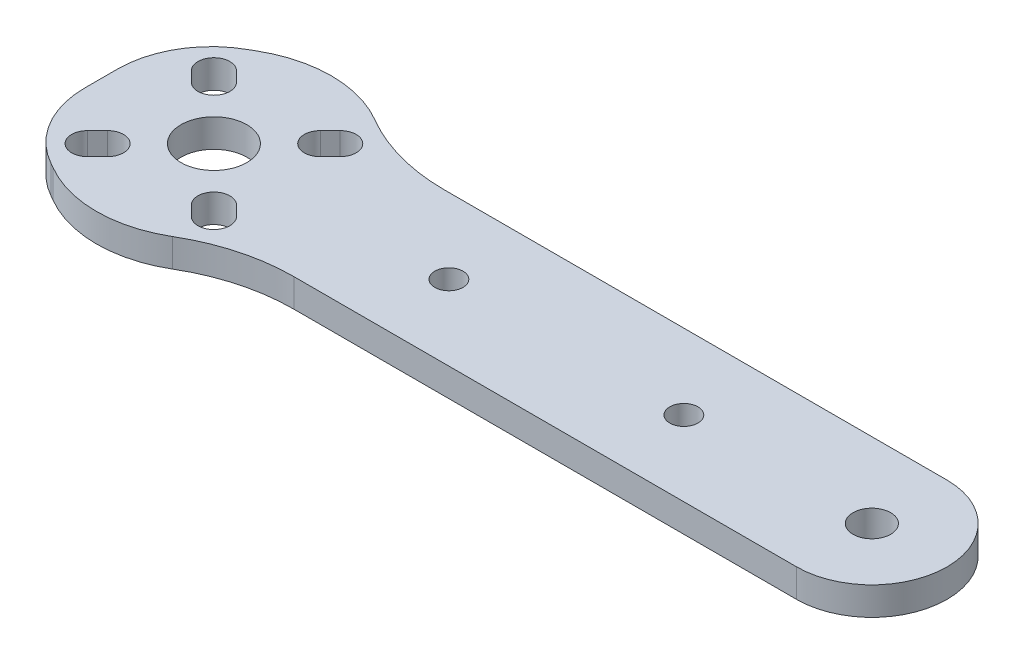
ISO-10303-21;
HEADER;
FILE_DESCRIPTION(('STEP AP214'),'2;1');
FILE_NAME('part.step','',(''),(''),'','','');
FILE_SCHEMA(('AUTOMOTIVE_DESIGN { 1 0 10303 214 1 1 1 1 }'));
ENDSEC;
DATA;
#1=APPLICATION_CONTEXT('core data for automotive mechanical design processes');
#2=APPLICATION_PROTOCOL_DEFINITION('international standard','automotive_design',2000,#1);
#3=PRODUCT_CONTEXT('',#1,'mechanical');
#4=PRODUCT('Part','Part','',(#3));
#5=PRODUCT_RELATED_PRODUCT_CATEGORY('part','',(#4));
#6=PRODUCT_DEFINITION_FORMATION('','',#4);
#7=PRODUCT_DEFINITION_CONTEXT('part definition',#1,'design');
#8=PRODUCT_DEFINITION('design','',#6,#7);
#9=PRODUCT_DEFINITION_SHAPE('','',#8);
#10=(LENGTH_UNIT() NAMED_UNIT(*) SI_UNIT(.MILLI.,.METRE.));
#11=(NAMED_UNIT(*) PLANE_ANGLE_UNIT() SI_UNIT($,.RADIAN.));
#12=(NAMED_UNIT(*) SI_UNIT($,.STERADIAN.) SOLID_ANGLE_UNIT());
#13=UNCERTAINTY_MEASURE_WITH_UNIT(LENGTH_MEASURE(1.E-05),#10,'distance_accuracy_value','');
#14=(GEOMETRIC_REPRESENTATION_CONTEXT(3) GLOBAL_UNCERTAINTY_ASSIGNED_CONTEXT((#13)) GLOBAL_UNIT_ASSIGNED_CONTEXT((#10,
#11,#12)) REPRESENTATION_CONTEXT('',''));
#15=CARTESIAN_POINT('',(0.,0.,0.));
#16=DIRECTION('',(0.,0.,1.));
#17=DIRECTION('',(1.,0.,0.));
#18=AXIS2_PLACEMENT_3D('',#15,#16,#17);
#19=CARTESIAN_POINT('',(0.,3.,-8.));
#20=DIRECTION('',(0.,0.,1.));
#21=DIRECTION('',(1.,0.,0.));
#22=AXIS2_PLACEMENT_3D('',#19,#20,#21);
#23=PLANE('',#22);
#24=DIRECTION('',(-1.,0.,0.));
#25=VECTOR('',#24,1.);
#26=CARTESIAN_POINT('',(0.,0.,-8.));
#27=LINE('',#26,#25);
#28=CARTESIAN_POINT('',(150.,0.,-8.));
#29=VERTEX_POINT('',#28);
#30=CARTESIAN_POINT('',(96.5,0.,-8.));
#31=VERTEX_POINT('',#30);
#32=EDGE_CURVE('E384',#29,#31,#27,.T.);
#33=ORIENTED_EDGE('',*,*,#32,.T.);
#34=DIRECTION('',(0.,1.,0.));
#35=VECTOR('',#34,1.);
#36=CARTESIAN_POINT('',(96.5,3.,-8.));
#37=LINE('',#36,#35);
#38=CARTESIAN_POINT('',(96.5,3.,-8.));
#39=VERTEX_POINT('',#38);
#40=EDGE_CURVE('E407',#31,#39,#37,.T.);
#41=ORIENTED_EDGE('',*,*,#40,.T.);
#42=DIRECTION('',(-1.,0.,0.));
#43=VECTOR('',#42,1.);
#44=CARTESIAN_POINT('',(0.,3.,-8.));
#45=LINE('',#44,#43);
#46=CARTESIAN_POINT('',(150.,3.,-8.));
#47=VERTEX_POINT('',#46);
#48=EDGE_CURVE('E386',#47,#39,#45,.T.);
#49=ORIENTED_EDGE('',*,*,#48,.F.);
#50=DIRECTION('',(0.,-1.,0.));
#51=VECTOR('',#50,1.);
#52=CARTESIAN_POINT('',(150.,3.,-8.));
#53=LINE('',#52,#51);
#54=EDGE_CURVE('E389',#47,#29,#53,.T.);
#55=ORIENTED_EDGE('',*,*,#54,.T.);
#56=EDGE_LOOP('',(#33,#41,#49,#55));
#57=FACE_BOUND('',#56,.T.);
#58=ADVANCED_FACE('F38',(#57),#23,.F.);
#59=CARTESIAN_POINT('',(0.,3.,8.));
#60=DIRECTION('',(0.,0.,-1.));
#61=DIRECTION('',(-1.,0.,0.));
#62=AXIS2_PLACEMENT_3D('',#59,#60,#61);
#63=PLANE('',#62);
#64=DIRECTION('',(1.,0.,0.));
#65=VECTOR('',#64,1.);
#66=CARTESIAN_POINT('',(0.,3.,8.));
#67=LINE('',#66,#65);
#68=CARTESIAN_POINT('',(96.5,3.,8.));
#69=VERTEX_POINT('',#68);
#70=CARTESIAN_POINT('',(150.,3.,8.));
#71=VERTEX_POINT('',#70);
#72=EDGE_CURVE('E381',#69,#71,#67,.T.);
#73=ORIENTED_EDGE('',*,*,#72,.F.);
#74=DIRECTION('',(0.,1.,0.));
#75=VECTOR('',#74,1.);
#76=CARTESIAN_POINT('',(96.5,3.,8.));
#77=LINE('',#76,#75);
#78=CARTESIAN_POINT('',(96.5,0.,8.));
#79=VERTEX_POINT('',#78);
#80=EDGE_CURVE('E404',#69,#79,#77,.F.);
#81=ORIENTED_EDGE('',*,*,#80,.T.);
#82=DIRECTION('',(1.,0.,0.));
#83=VECTOR('',#82,1.);
#84=CARTESIAN_POINT('',(0.,0.,8.));
#85=LINE('',#84,#83);
#86=CARTESIAN_POINT('',(150.,0.,8.));
#87=VERTEX_POINT('',#86);
#88=EDGE_CURVE('E376',#79,#87,#85,.T.);
#89=ORIENTED_EDGE('',*,*,#88,.T.);
#90=DIRECTION('',(0.,-1.,0.));
#91=VECTOR('',#90,1.);
#92=CARTESIAN_POINT('',(150.,3.,8.));
#93=LINE('',#92,#91);
#94=EDGE_CURVE('E397',#71,#87,#93,.T.);
#95=ORIENTED_EDGE('',*,*,#94,.F.);
#96=EDGE_LOOP('',(#73,#81,#89,#95));
#97=FACE_BOUND('',#96,.T.);
#98=ADVANCED_FACE('F521',(#97),#63,.F.);
#99=CARTESIAN_POINT('',(150.,3.,0.));
#100=DIRECTION('',(0.,-1.,0.));
#101=DIRECTION('',(0.,0.,-1.));
#102=AXIS2_PLACEMENT_3D('',#99,#100,#101);
#103=CYLINDRICAL_SURFACE('',#102,8.);
#104=CARTESIAN_POINT('',(150.,0.,0.));
#105=DIRECTION('',(0.,1.,0.));
#106=DIRECTION('',(0.,0.,1.));
#107=AXIS2_PLACEMENT_3D('',#104,#105,#106);
#108=CIRCLE('',#107,8.);
#109=EDGE_CURVE('E391',#87,#29,#108,.T.);
#110=ORIENTED_EDGE('',*,*,#109,.T.);
#111=ORIENTED_EDGE('',*,*,#54,.F.);
#112=CARTESIAN_POINT('',(150.,3.,0.));
#113=DIRECTION('',(0.,1.,0.));
#114=DIRECTION('',(0.,0.,1.));
#115=AXIS2_PLACEMENT_3D('',#112,#113,#114);
#116=CIRCLE('',#115,8.);
#117=EDGE_CURVE('E383',#71,#47,#116,.T.);
#118=ORIENTED_EDGE('',*,*,#117,.F.);
#119=ORIENTED_EDGE('',*,*,#94,.T.);
#120=EDGE_LOOP('',(#110,#111,#118,#119));
#121=FACE_BOUND('',#120,.T.);
#122=ADVANCED_FACE('F485',(#121),#103,.T.);
#123=CARTESIAN_POINT('',(0.,3.,0.));
#124=DIRECTION('',(0.,1.,0.));
#125=DIRECTION('',(0.,0.,1.));
#126=AXIS2_PLACEMENT_3D('',#123,#124,#125);
#127=PLANE('',#126);
#128=CARTESIAN_POINT('',(105.,3.,0.));
#129=DIRECTION('',(0.,1.,0.));
#130=DIRECTION('',(0.,0.,1.));
#131=AXIS2_PLACEMENT_3D('',#128,#129,#130);
#132=CIRCLE('',#131,1.5);
#133=CARTESIAN_POINT('',(105.,3.,1.49999999999997));
#134=VERTEX_POINT('',#133);
#135=EDGE_CURVE('E645',#134,#134,#132,.T.);
#136=ORIENTED_EDGE('',*,*,#135,.F.);
#137=EDGE_LOOP('',(#136));
#138=FACE_BOUND('',#137,.T.);
#139=CARTESIAN_POINT('',(130.,3.,0.));
#140=DIRECTION('',(0.,1.,0.));
#141=DIRECTION('',(0.,0.,1.));
#142=AXIS2_PLACEMENT_3D('',#139,#140,#141);
#143=CIRCLE('',#142,1.5);
#144=CARTESIAN_POINT('',(130.,3.,1.50000000000002));
#145=VERTEX_POINT('',#144);
#146=EDGE_CURVE('E470',#145,#145,#143,.T.);
#147=ORIENTED_EDGE('',*,*,#146,.F.);
#148=EDGE_LOOP('',(#147));
#149=FACE_BOUND('',#148,.T.);
#150=DIRECTION('',(0.,0.,-1.));
#151=VECTOR('',#150,1.);
#152=CARTESIAN_POINT('',(67.9999999999999,3.,13.1043403667517));
#153=LINE('',#152,#151);
#154=CARTESIAN_POINT('',(67.9999999999999,3.,1.73690802666216));
#155=VERTEX_POINT('',#154);
#156=CARTESIAN_POINT('',(67.9999999999999,3.,-1.73690802666216));
#157=VERTEX_POINT('',#156);
#158=EDGE_CURVE('E448',#155,#157,#153,.T.);
#159=ORIENTED_EDGE('',*,*,#158,.F.);
#160=CARTESIAN_POINT('',(77.9999999999999,3.,1.73690802666216));
#161=DIRECTION('',(0.,1.,0.));
#162=DIRECTION('',(0.,0.,1.));
#163=AXIS2_PLACEMENT_3D('',#160,#161,#162);
#164=CIRCLE('',#163,10.);
#165=CARTESIAN_POINT('',(73.1666666666666,3.,10.4912720177748));
#166=VERTEX_POINT('',#165);
#167=EDGE_CURVE('E46',#155,#166,#164,.T.);
#168=ORIENTED_EDGE('',*,*,#167,.T.);
#169=CARTESIAN_POINT('',(63.5,3.,28.));
#170=DIRECTION('',(0.,1.,0.));
#171=DIRECTION('',(0.,0.,1.));
#172=AXIS2_PLACEMENT_3D('',#169,#170,#171);
#173=CIRCLE('',#172,20.);
#174=CARTESIAN_POINT('',(73.6538461538461,3.,10.7692307692308));
#175=VERTEX_POINT('',#174);
#176=EDGE_CURVE('E414',#166,#175,#173,.F.);
#177=ORIENTED_EDGE('',*,*,#176,.T.);
#178=CARTESIAN_POINT('',(80.,3.,0.));
#179=DIRECTION('',(0.,1.,0.));
#180=DIRECTION('',(0.,0.,1.));
#181=AXIS2_PLACEMENT_3D('',#178,#179,#180);
#182=CIRCLE('',#181,12.5);
#183=CARTESIAN_POINT('',(86.3461538461539,3.,10.7692307692308));
#184=VERTEX_POINT('',#183);
#185=EDGE_CURVE('E370',#175,#184,#182,.T.);
#186=ORIENTED_EDGE('',*,*,#185,.T.);
#187=CARTESIAN_POINT('',(96.5,3.,28.));
#188=DIRECTION('',(0.,1.,0.));
#189=DIRECTION('',(0.,0.,1.));
#190=AXIS2_PLACEMENT_3D('',#187,#188,#189);
#191=CIRCLE('',#190,20.);
#192=EDGE_CURVE('E421',#184,#69,#191,.F.);
#193=ORIENTED_EDGE('',*,*,#192,.T.);
#194=ORIENTED_EDGE('',*,*,#72,.T.);
#195=ORIENTED_EDGE('',*,*,#117,.T.);
#196=ORIENTED_EDGE('',*,*,#48,.T.);
#197=CARTESIAN_POINT('',(96.5,3.,-28.));
#198=DIRECTION('',(0.,1.,0.));
#199=DIRECTION('',(0.,0.,1.));
#200=AXIS2_PLACEMENT_3D('',#197,#198,#199);
#201=CIRCLE('',#200,20.);
#202=CARTESIAN_POINT('',(86.3461538461539,3.,-10.7692307692308));
#203=VERTEX_POINT('',#202);
#204=EDGE_CURVE('E423',#39,#203,#201,.F.);
#205=ORIENTED_EDGE('',*,*,#204,.T.);
#206=CARTESIAN_POINT('',(73.6538461538461,3.,-10.7692307692308));
#207=VERTEX_POINT('',#206);
#208=EDGE_CURVE('E378',#203,#207,#182,.T.);
#209=ORIENTED_EDGE('',*,*,#208,.T.);
#210=CARTESIAN_POINT('',(63.5,3.,-28.));
#211=DIRECTION('',(0.,1.,0.));
#212=DIRECTION('',(0.,0.,1.));
#213=AXIS2_PLACEMENT_3D('',#210,#211,#212);
#214=CIRCLE('',#213,20.);
#215=CARTESIAN_POINT('',(73.1666666666666,3.,-10.4912720177748));
#216=VERTEX_POINT('',#215);
#217=EDGE_CURVE('E429',#207,#216,#214,.F.);
#218=ORIENTED_EDGE('',*,*,#217,.T.);
#219=CARTESIAN_POINT('',(77.9999999999999,3.,-1.73690802666216));
#220=DIRECTION('',(0.,1.,0.));
#221=DIRECTION('',(0.,0.,1.));
#222=AXIS2_PLACEMENT_3D('',#219,#220,#221);
#223=CIRCLE('',#222,10.);
#224=EDGE_CURVE('E53',#216,#157,#223,.T.);
#225=ORIENTED_EDGE('',*,*,#224,.T.);
#226=EDGE_LOOP('',(#159,#168,#177,#186,#193,#194,#195,#196,#205,#209,#218,#225));
#227=FACE_BOUND('',#226,.T.);
#228=CARTESIAN_POINT('',(150.,3.,0.));
#229=DIRECTION('',(0.,1.,0.));
#230=DIRECTION('',(0.,0.,1.));
#231=AXIS2_PLACEMENT_3D('',#228,#229,#230);
#232=CIRCLE('',#231,2.);
#233=CARTESIAN_POINT('',(150.,3.,2.));
#234=VERTEX_POINT('',#233);
#235=EDGE_CURVE('E254',#234,#234,#232,.T.);
#236=ORIENTED_EDGE('',*,*,#235,.F.);
#237=EDGE_LOOP('',(#236));
#238=FACE_BOUND('',#237,.T.);
#239=CARTESIAN_POINT('',(74.3431457505076,3.,-5.65685424949287));
#240=DIRECTION('',(0.,1.,0.));
#241=DIRECTION('',(0.,0.,1.));
#242=AXIS2_PLACEMENT_3D('',#239,#240,#241);
#243=CIRCLE('',#242,1.6979115544887);
#244=CARTESIAN_POINT('',(73.1425409764736,3.,-4.45624947545895));
#245=VERTEX_POINT('',#244);
#246=CARTESIAN_POINT('',(75.5437505245415,3.,-6.85745902352682));
#247=VERTEX_POINT('',#246);
#248=EDGE_CURVE('E349',#245,#247,#243,.T.);
#249=ORIENTED_EDGE('',*,*,#248,.F.);
#250=DIRECTION('',(0.707106781186543,0.,0.707106781186552));
#251=VECTOR('',#250,1.);
#252=CARTESIAN_POINT('',(73.1425409764736,3.,-4.45624947545895));
#253=LINE('',#252,#251);
#254=CARTESIAN_POINT('',(72.0818808046938,3.,-5.51690964723878));
#255=VERTEX_POINT('',#254);
#256=EDGE_CURVE('E339',#255,#245,#253,.T.);
#257=ORIENTED_EDGE('',*,*,#256,.F.);
#258=CARTESIAN_POINT('',(73.2824855787278,3.,-6.71751442127272));
#259=DIRECTION('',(0.,1.,0.));
#260=DIRECTION('',(0.,0.,1.));
#261=AXIS2_PLACEMENT_3D('',#258,#259,#260);
#262=CIRCLE('',#261,1.69791155448871);
#263=CARTESIAN_POINT('',(74.4830903527617,3.,-7.91811919530665));
#264=VERTEX_POINT('',#263);
#265=EDGE_CURVE('E355',#264,#255,#262,.T.);
#266=ORIENTED_EDGE('',*,*,#265,.F.);
#267=DIRECTION('',(-0.707106781186534,0.,-0.707106781186561));
#268=VECTOR('',#267,1.);
#269=CARTESIAN_POINT('',(75.5437505245415,3.,-6.85745902352682));
#270=LINE('',#269,#268);
#271=EDGE_CURVE('E351',#247,#264,#270,.T.);
#272=ORIENTED_EDGE('',*,*,#271,.F.);
#273=EDGE_LOOP('',(#249,#257,#266,#272));
#274=FACE_BOUND('',#273,.T.);
#275=CARTESIAN_POINT('',(74.3431457505076,3.,5.65685424949184));
#276=DIRECTION('',(0.,1.,0.));
#277=DIRECTION('',(0.,0.,1.));
#278=AXIS2_PLACEMENT_3D('',#275,#276,#277);
#279=CIRCLE('',#278,1.6979115544887);
#280=CARTESIAN_POINT('',(75.5437505245415,3.,6.85745902352582));
#281=VERTEX_POINT('',#280);
#282=CARTESIAN_POINT('',(73.1425409764736,3.,4.45624947545789));
#283=VERTEX_POINT('',#282);
#284=EDGE_CURVE('E317',#281,#283,#279,.T.);
#285=ORIENTED_EDGE('',*,*,#284,.F.);
#286=DIRECTION('',(0.707106781186557,0.,-0.707106781186538));
#287=VECTOR('',#286,1.);
#288=CARTESIAN_POINT('',(75.5437505245415,3.,6.85745902352582));
#289=LINE('',#288,#287);
#290=CARTESIAN_POINT('',(74.4830903527617,3.,7.91811919530564));
#291=VERTEX_POINT('',#290);
#292=EDGE_CURVE('E307',#291,#281,#289,.T.);
#293=ORIENTED_EDGE('',*,*,#292,.F.);
#294=CARTESIAN_POINT('',(73.2824855787277,3.,6.71751442127167));
#295=DIRECTION('',(0.,1.,0.));
#296=DIRECTION('',(0.,0.,1.));
#297=AXIS2_PLACEMENT_3D('',#294,#295,#296);
#298=CIRCLE('',#297,1.6979115544887);
#299=CARTESIAN_POINT('',(72.0818808046938,3.,5.51690964723769));
#300=VERTEX_POINT('',#299);
#301=EDGE_CURVE('E323',#300,#291,#298,.T.);
#302=ORIENTED_EDGE('',*,*,#301,.F.);
#303=DIRECTION('',(-0.707106781186558,0.,0.707106781186537));
#304=VECTOR('',#303,1.);
#305=CARTESIAN_POINT('',(73.1425409764736,3.,4.45624947545789));
#306=LINE('',#305,#304);
#307=EDGE_CURVE('E319',#283,#300,#306,.T.);
#308=ORIENTED_EDGE('',*,*,#307,.F.);
#309=EDGE_LOOP('',(#285,#293,#302,#308));
#310=FACE_BOUND('',#309,.T.);
#311=CARTESIAN_POINT('',(85.6568542494923,3.,5.65685424949184));
#312=DIRECTION('',(0.,1.,0.));
#313=DIRECTION('',(0.,0.,1.));
#314=AXIS2_PLACEMENT_3D('',#311,#312,#313);
#315=CIRCLE('',#314,1.6979115544887);
#316=CARTESIAN_POINT('',(86.8574590235263,3.,4.45624947545792));
#317=VERTEX_POINT('',#316);
#318=CARTESIAN_POINT('',(84.4562494754584,3.,6.85745902352579));
#319=VERTEX_POINT('',#318);
#320=EDGE_CURVE('E285',#317,#319,#315,.T.);
#321=ORIENTED_EDGE('',*,*,#320,.F.);
#322=DIRECTION('',(-0.707106781186543,0.,-0.707106781186552));
#323=VECTOR('',#322,1.);
#324=CARTESIAN_POINT('',(86.8574590235263,3.,4.45624947545792));
#325=LINE('',#324,#323);
#326=CARTESIAN_POINT('',(87.9181191953061,3.,5.51690964723775));
#327=VERTEX_POINT('',#326);
#328=EDGE_CURVE('E275',#327,#317,#325,.T.);
#329=ORIENTED_EDGE('',*,*,#328,.F.);
#330=CARTESIAN_POINT('',(86.7175144212722,3.,6.71751442127168));
#331=DIRECTION('',(0.,1.,0.));
#332=DIRECTION('',(0.,0.,1.));
#333=AXIS2_PLACEMENT_3D('',#330,#331,#332);
#334=CIRCLE('',#333,1.69791155448871);
#335=CARTESIAN_POINT('',(85.5169096472382,3.,7.91811919530561));
#336=VERTEX_POINT('',#335);
#337=EDGE_CURVE('E291',#336,#327,#334,.T.);
#338=ORIENTED_EDGE('',*,*,#337,.F.);
#339=DIRECTION('',(0.707106781186534,0.,0.707106781186561));
#340=VECTOR('',#339,1.);
#341=CARTESIAN_POINT('',(84.4562494754584,3.,6.85745902352579));
#342=LINE('',#341,#340);
#343=EDGE_CURVE('E287',#319,#336,#342,.T.);
#344=ORIENTED_EDGE('',*,*,#343,.F.);
#345=EDGE_LOOP('',(#321,#329,#338,#344));
#346=FACE_BOUND('',#345,.T.);
#347=CARTESIAN_POINT('',(85.6568542494923,3.,-5.65685424949296));
#348=DIRECTION('',(0.,1.,0.));
#349=DIRECTION('',(0.,0.,1.));
#350=AXIS2_PLACEMENT_3D('',#347,#348,#349);
#351=CIRCLE('',#350,1.69791155448878);
#352=CARTESIAN_POINT('',(84.4562494754584,3.,-6.85745902352686));
#353=VERTEX_POINT('',#352);
#354=CARTESIAN_POINT('',(86.8574590235263,3.,-4.45624947545877));
#355=VERTEX_POINT('',#354);
#356=EDGE_CURVE('E230',#353,#355,#351,.T.);
#357=ORIENTED_EDGE('',*,*,#356,.F.);
#358=DIRECTION('',(-0.707106781186553,0.,0.707106781186542));
#359=VECTOR('',#358,1.);
#360=CARTESIAN_POINT('',(84.4562494754584,3.,-6.85745902352686));
#361=LINE('',#360,#359);
#362=CARTESIAN_POINT('',(85.5169096472382,3.,-7.91811919530667));
#363=VERTEX_POINT('',#362);
#364=EDGE_CURVE('E248',#363,#353,#361,.T.);
#365=ORIENTED_EDGE('',*,*,#364,.F.);
#366=CARTESIAN_POINT('',(86.7175144212722,3.,-6.71751442127273));
#367=DIRECTION('',(0.,1.,0.));
#368=DIRECTION('',(0.,0.,1.));
#369=AXIS2_PLACEMENT_3D('',#366,#367,#368);
#370=CIRCLE('',#369,1.69791155448878);
#371=CARTESIAN_POINT('',(87.9181191953061,3.,-5.51690964723863));
#372=VERTEX_POINT('',#371);
#373=EDGE_CURVE('E251',#372,#363,#370,.T.);
#374=ORIENTED_EDGE('',*,*,#373,.F.);
#375=DIRECTION('',(0.707106781186547,0.,-0.707106781186547));
#376=VECTOR('',#375,1.);
#377=CARTESIAN_POINT('',(86.8574590235263,3.,-4.45624947545876));
#378=LINE('',#377,#376);
#379=EDGE_CURVE('E260',#355,#372,#378,.T.);
#380=ORIENTED_EDGE('',*,*,#379,.F.);
#381=EDGE_LOOP('',(#357,#365,#374,#380));
#382=FACE_BOUND('',#381,.T.);
#383=CARTESIAN_POINT('',(79.9999999999999,3.,-6.06775432368231E-13));
#384=DIRECTION('',(0.,1.,0.));
#385=DIRECTION('',(0.,0.,1.));
#386=AXIS2_PLACEMENT_3D('',#383,#384,#385);
#387=CIRCLE('',#386,3.49999999999998);
#388=CARTESIAN_POINT('',(79.9999999999999,3.,3.49999999999938));
#389=VERTEX_POINT('',#388);
#390=EDGE_CURVE('E267',#389,#389,#387,.T.);
#391=ORIENTED_EDGE('',*,*,#390,.F.);
#392=EDGE_LOOP('',(#391));
#393=FACE_BOUND('',#392,.T.);
#394=ADVANCED_FACE('F444',(#138,#149,#227,#238,#274,#310,#346,#382,#393),#127,.T.);
#395=CARTESIAN_POINT('',(0.,0.,0.));
#396=DIRECTION('',(0.,1.,0.));
#397=DIRECTION('',(0.,0.,1.));
#398=AXIS2_PLACEMENT_3D('',#395,#396,#397);
#399=PLANE('',#398);
#400=CARTESIAN_POINT('',(105.,0.,0.));
#401=DIRECTION('',(0.,1.,0.));
#402=DIRECTION('',(0.,0.,1.));
#403=AXIS2_PLACEMENT_3D('',#400,#401,#402);
#404=CIRCLE('',#403,1.5);
#405=CARTESIAN_POINT('',(105.,0.,1.49999999999997));
#406=VERTEX_POINT('',#405);
#407=EDGE_CURVE('E467',#406,#406,#404,.T.);
#408=ORIENTED_EDGE('',*,*,#407,.T.);
#409=EDGE_LOOP('',(#408));
#410=FACE_BOUND('',#409,.T.);
#411=CARTESIAN_POINT('',(130.,0.,0.));
#412=DIRECTION('',(0.,1.,0.));
#413=DIRECTION('',(0.,0.,1.));
#414=AXIS2_PLACEMENT_3D('',#411,#412,#413);
#415=CIRCLE('',#414,1.5);
#416=CARTESIAN_POINT('',(130.,0.,1.50000000000002));
#417=VERTEX_POINT('',#416);
#418=EDGE_CURVE('E643',#417,#417,#415,.T.);
#419=ORIENTED_EDGE('',*,*,#418,.T.);
#420=EDGE_LOOP('',(#419));
#421=FACE_BOUND('',#420,.T.);
#422=CARTESIAN_POINT('',(150.,0.,0.));
#423=DIRECTION('',(0.,1.,0.));
#424=DIRECTION('',(0.,0.,1.));
#425=AXIS2_PLACEMENT_3D('',#422,#423,#424);
#426=CIRCLE('',#425,2.);
#427=CARTESIAN_POINT('',(150.,0.,2.));
#428=VERTEX_POINT('',#427);
#429=EDGE_CURVE('E352',#428,#428,#426,.T.);
#430=ORIENTED_EDGE('',*,*,#429,.T.);
#431=EDGE_LOOP('',(#430));
#432=FACE_BOUND('',#431,.T.);
#433=DIRECTION('',(0.707106781186543,0.,0.707106781186552));
#434=VECTOR('',#433,1.);
#435=CARTESIAN_POINT('',(73.1425409764736,0.,-4.45624947545895));
#436=LINE('',#435,#434);
#437=CARTESIAN_POINT('',(72.0818808046938,0.,-5.51690964723878));
#438=VERTEX_POINT('',#437);
#439=CARTESIAN_POINT('',(73.1425409764736,0.,-4.45624947545895));
#440=VERTEX_POINT('',#439);
#441=EDGE_CURVE('E345',#438,#440,#436,.T.);
#442=ORIENTED_EDGE('',*,*,#441,.T.);
#443=CARTESIAN_POINT('',(74.3431457505076,0.,-5.65685424949287));
#444=DIRECTION('',(0.,1.,0.));
#445=DIRECTION('',(0.,0.,1.));
#446=AXIS2_PLACEMENT_3D('',#443,#444,#445);
#447=CIRCLE('',#446,1.6979115544887);
#448=CARTESIAN_POINT('',(75.5437505245415,0.,-6.85745902352682));
#449=VERTEX_POINT('',#448);
#450=EDGE_CURVE('E335',#440,#449,#447,.T.);
#451=ORIENTED_EDGE('',*,*,#450,.T.);
#452=DIRECTION('',(-0.707106781186534,0.,-0.707106781186561));
#453=VECTOR('',#452,1.);
#454=CARTESIAN_POINT('',(75.5437505245415,0.,-6.85745902352682));
#455=LINE('',#454,#453);
#456=CARTESIAN_POINT('',(74.4830903527618,0.,-7.91811919530665));
#457=VERTEX_POINT('',#456);
#458=EDGE_CURVE('E338',#449,#457,#455,.T.);
#459=ORIENTED_EDGE('',*,*,#458,.T.);
#460=CARTESIAN_POINT('',(73.2824855787278,0.,-6.71751442127272));
#461=DIRECTION('',(0.,1.,0.));
#462=DIRECTION('',(0.,0.,1.));
#463=AXIS2_PLACEMENT_3D('',#460,#461,#462);
#464=CIRCLE('',#463,1.69791155448871);
#465=EDGE_CURVE('E342',#457,#438,#464,.T.);
#466=ORIENTED_EDGE('',*,*,#465,.T.);
#467=EDGE_LOOP('',(#442,#451,#459,#466));
#468=FACE_BOUND('',#467,.T.);
#469=DIRECTION('',(0.707106781186557,0.,-0.707106781186538));
#470=VECTOR('',#469,1.);
#471=CARTESIAN_POINT('',(75.5437505245415,0.,6.85745902352582));
#472=LINE('',#471,#470);
#473=CARTESIAN_POINT('',(74.4830903527617,0.,7.91811919530564));
#474=VERTEX_POINT('',#473);
#475=CARTESIAN_POINT('',(75.5437505245415,0.,6.85745902352582));
#476=VERTEX_POINT('',#475);
#477=EDGE_CURVE('E313',#474,#476,#472,.T.);
#478=ORIENTED_EDGE('',*,*,#477,.T.);
#479=CARTESIAN_POINT('',(74.3431457505076,0.,5.65685424949184));
#480=DIRECTION('',(0.,1.,0.));
#481=DIRECTION('',(0.,0.,1.));
#482=AXIS2_PLACEMENT_3D('',#479,#480,#481);
#483=CIRCLE('',#482,1.6979115544887);
#484=CARTESIAN_POINT('',(73.1425409764736,0.,4.45624947545789));
#485=VERTEX_POINT('',#484);
#486=EDGE_CURVE('E303',#476,#485,#483,.T.);
#487=ORIENTED_EDGE('',*,*,#486,.T.);
#488=DIRECTION('',(-0.707106781186558,0.,0.707106781186537));
#489=VECTOR('',#488,1.);
#490=CARTESIAN_POINT('',(73.1425409764736,0.,4.45624947545789));
#491=LINE('',#490,#489);
#492=CARTESIAN_POINT('',(72.0818808046938,0.,5.51690964723769));
#493=VERTEX_POINT('',#492);
#494=EDGE_CURVE('E306',#485,#493,#491,.T.);
#495=ORIENTED_EDGE('',*,*,#494,.T.);
#496=CARTESIAN_POINT('',(73.2824855787277,0.,6.71751442127167));
#497=DIRECTION('',(0.,1.,0.));
#498=DIRECTION('',(0.,0.,1.));
#499=AXIS2_PLACEMENT_3D('',#496,#497,#498);
#500=CIRCLE('',#499,1.6979115544887);
#501=EDGE_CURVE('E310',#493,#474,#500,.T.);
#502=ORIENTED_EDGE('',*,*,#501,.T.);
#503=EDGE_LOOP('',(#478,#487,#495,#502));
#504=FACE_BOUND('',#503,.T.);
#505=DIRECTION('',(-0.707106781186543,0.,-0.707106781186552));
#506=VECTOR('',#505,1.);
#507=CARTESIAN_POINT('',(86.8574590235263,0.,4.45624947545792));
#508=LINE('',#507,#506);
#509=CARTESIAN_POINT('',(87.9181191953061,0.,5.51690964723775));
#510=VERTEX_POINT('',#509);
#511=CARTESIAN_POINT('',(86.8574590235263,0.,4.45624947545792));
#512=VERTEX_POINT('',#511);
#513=EDGE_CURVE('E281',#510,#512,#508,.T.);
#514=ORIENTED_EDGE('',*,*,#513,.T.);
#515=CARTESIAN_POINT('',(85.6568542494923,0.,5.65685424949184));
#516=DIRECTION('',(0.,1.,0.));
#517=DIRECTION('',(0.,0.,1.));
#518=AXIS2_PLACEMENT_3D('',#515,#516,#517);
#519=CIRCLE('',#518,1.6979115544887);
#520=CARTESIAN_POINT('',(84.4562494754584,0.,6.85745902352579));
#521=VERTEX_POINT('',#520);
#522=EDGE_CURVE('E271',#512,#521,#519,.T.);
#523=ORIENTED_EDGE('',*,*,#522,.T.);
#524=DIRECTION('',(0.707106781186534,0.,0.707106781186561));
#525=VECTOR('',#524,1.);
#526=CARTESIAN_POINT('',(84.4562494754584,0.,6.85745902352579));
#527=LINE('',#526,#525);
#528=CARTESIAN_POINT('',(85.5169096472381,0.,7.91811919530561));
#529=VERTEX_POINT('',#528);
#530=EDGE_CURVE('E274',#521,#529,#527,.T.);
#531=ORIENTED_EDGE('',*,*,#530,.T.);
#532=CARTESIAN_POINT('',(86.7175144212722,0.,6.71751442127168));
#533=DIRECTION('',(0.,1.,0.));
#534=DIRECTION('',(0.,0.,1.));
#535=AXIS2_PLACEMENT_3D('',#532,#533,#534);
#536=CIRCLE('',#535,1.69791155448871);
#537=EDGE_CURVE('E278',#529,#510,#536,.T.);
#538=ORIENTED_EDGE('',*,*,#537,.T.);
#539=EDGE_LOOP('',(#514,#523,#531,#538));
#540=FACE_BOUND('',#539,.T.);
#541=DIRECTION('',(-0.707106781186553,0.,0.707106781186542));
#542=VECTOR('',#541,1.);
#543=CARTESIAN_POINT('',(84.4562494754584,0.,-6.85745902352686));
#544=LINE('',#543,#542);
#545=CARTESIAN_POINT('',(85.5169096472382,0.,-7.91811919530667));
#546=VERTEX_POINT('',#545);
#547=CARTESIAN_POINT('',(84.4562494754584,0.,-6.85745902352686));
#548=VERTEX_POINT('',#547);
#549=EDGE_CURVE('E235',#546,#548,#544,.T.);
#550=ORIENTED_EDGE('',*,*,#549,.T.);
#551=CARTESIAN_POINT('',(85.6568542494923,0.,-5.65685424949296));
#552=DIRECTION('',(0.,1.,0.));
#553=DIRECTION('',(0.,0.,1.));
#554=AXIS2_PLACEMENT_3D('',#551,#552,#553);
#555=CIRCLE('',#554,1.69791155448878);
#556=CARTESIAN_POINT('',(86.8574590235263,0.,-4.45624947545876));
#557=VERTEX_POINT('',#556);
#558=EDGE_CURVE('E227',#548,#557,#555,.T.);
#559=ORIENTED_EDGE('',*,*,#558,.T.);
#560=DIRECTION('',(0.707106781186547,0.,-0.707106781186547));
#561=VECTOR('',#560,1.);
#562=CARTESIAN_POINT('',(86.8574590235263,0.,-4.45624947545876));
#563=LINE('',#562,#561);
#564=CARTESIAN_POINT('',(87.9181191953061,0.,-5.51690964723857));
#565=VERTEX_POINT('',#564);
#566=EDGE_CURVE('E239',#557,#565,#563,.T.);
#567=ORIENTED_EDGE('',*,*,#566,.T.);
#568=CARTESIAN_POINT('',(86.7175144212722,0.,-6.71751442127273));
#569=DIRECTION('',(0.,1.,0.));
#570=DIRECTION('',(0.,0.,1.));
#571=AXIS2_PLACEMENT_3D('',#568,#569,#570);
#572=CIRCLE('',#571,1.69791155448878);
#573=EDGE_CURVE('E243',#565,#546,#572,.T.);
#574=ORIENTED_EDGE('',*,*,#573,.T.);
#575=EDGE_LOOP('',(#550,#559,#567,#574));
#576=FACE_BOUND('',#575,.T.);
#577=CARTESIAN_POINT('',(79.9999999999999,0.,-6.06775432368231E-13));
#578=DIRECTION('',(0.,1.,0.));
#579=DIRECTION('',(0.,0.,1.));
#580=AXIS2_PLACEMENT_3D('',#577,#578,#579);
#581=CIRCLE('',#580,3.49999999999998);
#582=CARTESIAN_POINT('',(79.9999999999999,0.,3.49999999999938));
#583=VERTEX_POINT('',#582);
#584=EDGE_CURVE('E367',#583,#583,#581,.T.);
#585=ORIENTED_EDGE('',*,*,#584,.T.);
#586=EDGE_LOOP('',(#585));
#587=FACE_BOUND('',#586,.T.);
#588=CARTESIAN_POINT('',(63.5,0.,28.));
#589=DIRECTION('',(0.,1.,0.));
#590=DIRECTION('',(0.,0.,1.));
#591=AXIS2_PLACEMENT_3D('',#588,#589,#590);
#592=CIRCLE('',#591,20.);
#593=CARTESIAN_POINT('',(73.6538461538461,0.,10.7692307692308));
#594=VERTEX_POINT('',#593);
#595=CARTESIAN_POINT('',(73.1666666666666,0.,10.4912720177748));
#596=VERTEX_POINT('',#595);
#597=EDGE_CURVE('E416',#594,#596,#592,.T.);
#598=ORIENTED_EDGE('',*,*,#597,.T.);
#599=CARTESIAN_POINT('',(77.9999999999999,0.,1.73690802666216));
#600=DIRECTION('',(0.,1.,0.));
#601=DIRECTION('',(0.,0.,1.));
#602=AXIS2_PLACEMENT_3D('',#599,#600,#601);
#603=CIRCLE('',#602,10.);
#604=CARTESIAN_POINT('',(67.9999999999999,0.,1.73690802666216));
#605=VERTEX_POINT('',#604);
#606=EDGE_CURVE('E436',#596,#605,#603,.F.);
#607=ORIENTED_EDGE('',*,*,#606,.T.);
#608=DIRECTION('',(0.,0.,-1.));
#609=VECTOR('',#608,1.);
#610=CARTESIAN_POINT('',(67.9999999999999,0.,13.1043403667517));
#611=LINE('',#610,#609);
#612=CARTESIAN_POINT('',(67.9999999999999,0.,-1.73690802666216));
#613=VERTEX_POINT('',#612);
#614=EDGE_CURVE('E460',#605,#613,#611,.T.);
#615=ORIENTED_EDGE('',*,*,#614,.T.);
#616=CARTESIAN_POINT('',(77.9999999999999,0.,-1.73690802666216));
#617=DIRECTION('',(0.,1.,0.));
#618=DIRECTION('',(0.,0.,1.));
#619=AXIS2_PLACEMENT_3D('',#616,#617,#618);
#620=CIRCLE('',#619,10.);
#621=CARTESIAN_POINT('',(73.1666666666666,0.,-10.4912720177748));
#622=VERTEX_POINT('',#621);
#623=EDGE_CURVE('E434',#613,#622,#620,.F.);
#624=ORIENTED_EDGE('',*,*,#623,.T.);
#625=CARTESIAN_POINT('',(63.5,0.,-28.));
#626=DIRECTION('',(0.,1.,0.));
#627=DIRECTION('',(0.,0.,1.));
#628=AXIS2_PLACEMENT_3D('',#625,#626,#627);
#629=CIRCLE('',#628,20.);
#630=CARTESIAN_POINT('',(73.6538461538461,0.,-10.7692307692308));
#631=VERTEX_POINT('',#630);
#632=EDGE_CURVE('E427',#622,#631,#629,.T.);
#633=ORIENTED_EDGE('',*,*,#632,.T.);
#634=CARTESIAN_POINT('',(80.,0.,0.));
#635=DIRECTION('',(0.,1.,0.));
#636=DIRECTION('',(0.,0.,1.));
#637=AXIS2_PLACEMENT_3D('',#634,#635,#636);
#638=CIRCLE('',#637,12.5);
#639=CARTESIAN_POINT('',(86.3461538461539,0.,-10.7692307692308));
#640=VERTEX_POINT('',#639);
#641=EDGE_CURVE('E373',#640,#631,#638,.T.);
#642=ORIENTED_EDGE('',*,*,#641,.F.);
#643=CARTESIAN_POINT('',(96.5,0.,-28.));
#644=DIRECTION('',(0.,1.,0.));
#645=DIRECTION('',(0.,0.,1.));
#646=AXIS2_PLACEMENT_3D('',#643,#644,#645);
#647=CIRCLE('',#646,20.);
#648=EDGE_CURVE('E425',#640,#31,#647,.T.);
#649=ORIENTED_EDGE('',*,*,#648,.T.);
#650=ORIENTED_EDGE('',*,*,#32,.F.);
#651=ORIENTED_EDGE('',*,*,#109,.F.);
#652=ORIENTED_EDGE('',*,*,#88,.F.);
#653=CARTESIAN_POINT('',(96.5,0.,28.));
#654=DIRECTION('',(0.,1.,0.));
#655=DIRECTION('',(0.,0.,1.));
#656=AXIS2_PLACEMENT_3D('',#653,#654,#655);
#657=CIRCLE('',#656,20.);
#658=CARTESIAN_POINT('',(86.3461538461539,0.,10.7692307692308));
#659=VERTEX_POINT('',#658);
#660=EDGE_CURVE('E419',#79,#659,#657,.T.);
#661=ORIENTED_EDGE('',*,*,#660,.T.);
#662=EDGE_CURVE('E377',#594,#659,#638,.T.);
#663=ORIENTED_EDGE('',*,*,#662,.F.);
#664=EDGE_LOOP('',(#598,#607,#615,#624,#633,#642,#649,#650,#651,#652,#661,#663));
#665=FACE_BOUND('',#664,.T.);
#666=ADVANCED_FACE('F245',(#410,#421,#432,#468,#504,#540,#576,#587,#665),#399,.F.);
#667=CARTESIAN_POINT('',(80.,0.,0.));
#668=DIRECTION('',(0.,1.,0.));
#669=DIRECTION('',(0.,0.,1.));
#670=AXIS2_PLACEMENT_3D('',#667,#668,#669);
#671=CYLINDRICAL_SURFACE('',#670,12.5);
#672=ORIENTED_EDGE('',*,*,#208,.F.);
#673=DIRECTION('',(0.,1.,0.));
#674=VECTOR('',#673,1.);
#675=CARTESIAN_POINT('',(86.3461538461539,0.,-10.7692307692308));
#676=LINE('',#675,#674);
#677=EDGE_CURVE('E412',#203,#640,#676,.F.);
#678=ORIENTED_EDGE('',*,*,#677,.T.);
#679=ORIENTED_EDGE('',*,*,#641,.T.);
#680=DIRECTION('',(0.,1.,0.));
#681=VECTOR('',#680,1.);
#682=CARTESIAN_POINT('',(73.6538461538461,0.,-10.7692307692308));
#683=LINE('',#682,#681);
#684=EDGE_CURVE('E410',#631,#207,#683,.T.);
#685=ORIENTED_EDGE('',*,*,#684,.T.);
#686=EDGE_LOOP('',(#672,#678,#679,#685));
#687=FACE_BOUND('',#686,.T.);
#688=ADVANCED_FACE('F515',(#687),#671,.T.);
#689=ORIENTED_EDGE('',*,*,#185,.F.);
#690=DIRECTION('',(0.,1.,0.));
#691=VECTOR('',#690,1.);
#692=CARTESIAN_POINT('',(73.6538461538461,0.,10.7692307692308));
#693=LINE('',#692,#691);
#694=EDGE_CURVE('E402',#175,#594,#693,.F.);
#695=ORIENTED_EDGE('',*,*,#694,.T.);
#696=ORIENTED_EDGE('',*,*,#662,.T.);
#697=DIRECTION('',(0.,1.,0.));
#698=VECTOR('',#697,1.);
#699=CARTESIAN_POINT('',(86.3461538461539,0.,10.7692307692308));
#700=LINE('',#699,#698);
#701=EDGE_CURVE('E400',#659,#184,#700,.T.);
#702=ORIENTED_EDGE('',*,*,#701,.T.);
#703=EDGE_LOOP('',(#689,#695,#696,#702));
#704=FACE_BOUND('',#703,.T.);
#705=ADVANCED_FACE('F506',(#704),#671,.T.);
#706=CARTESIAN_POINT('',(79.9999999999999,0.,-6.06775432368231E-13));
#707=DIRECTION('',(0.,1.,0.));
#708=DIRECTION('',(0.,0.,1.));
#709=AXIS2_PLACEMENT_3D('',#706,#707,#708);
#710=CYLINDRICAL_SURFACE('',#709,3.49999999999998);
#711=ORIENTED_EDGE('',*,*,#584,.F.);
#712=EDGE_LOOP('',(#711));
#713=FACE_BOUND('',#712,.T.);
#714=ORIENTED_EDGE('',*,*,#390,.T.);
#715=EDGE_LOOP('',(#714));
#716=FACE_BOUND('',#715,.T.);
#717=ADVANCED_FACE('F504',(#713,#716),#710,.F.);
#718=CARTESIAN_POINT('',(85.6568542494923,0.,-5.65685424949296));
#719=DIRECTION('',(0.,1.,0.));
#720=DIRECTION('',(0.,0.,1.));
#721=AXIS2_PLACEMENT_3D('',#718,#719,#720);
#722=CYLINDRICAL_SURFACE('',#721,1.69791155448878);
#723=ORIENTED_EDGE('',*,*,#356,.T.);
#724=DIRECTION('',(0.,1.,0.));
#725=VECTOR('',#724,1.);
#726=CARTESIAN_POINT('',(86.8574590235263,0.,-4.45624947545876));
#727=LINE('',#726,#725);
#728=EDGE_CURVE('E223',#557,#355,#727,.T.);
#729=ORIENTED_EDGE('',*,*,#728,.F.);
#730=ORIENTED_EDGE('',*,*,#558,.F.);
#731=DIRECTION('',(0.,1.,0.));
#732=VECTOR('',#731,1.);
#733=CARTESIAN_POINT('',(84.4562494754584,0.,-6.85745902352686));
#734=LINE('',#733,#732);
#735=EDGE_CURVE('E265',#548,#353,#734,.T.);
#736=ORIENTED_EDGE('',*,*,#735,.T.);
#737=EDGE_LOOP('',(#723,#729,#730,#736));
#738=FACE_BOUND('',#737,.T.);
#739=ADVANCED_FACE('F225',(#738),#722,.F.);
#740=CARTESIAN_POINT('',(84.4562494754584,0.,-6.85745902352686));
#741=DIRECTION('',(-0.707106781186542,0.,-0.707106781186553));
#742=DIRECTION('',(-0.707106781186553,0.,0.707106781186542));
#743=AXIS2_PLACEMENT_3D('',#740,#741,#742);
#744=PLANE('',#743);
#745=ORIENTED_EDGE('',*,*,#364,.T.);
#746=ORIENTED_EDGE('',*,*,#735,.F.);
#747=ORIENTED_EDGE('',*,*,#549,.F.);
#748=DIRECTION('',(0.,1.,0.));
#749=VECTOR('',#748,1.);
#750=CARTESIAN_POINT('',(85.5169096472382,0.,-7.91811919530667));
#751=LINE('',#750,#749);
#752=EDGE_CURVE('E268',#546,#363,#751,.T.);
#753=ORIENTED_EDGE('',*,*,#752,.T.);
#754=EDGE_LOOP('',(#745,#746,#747,#753));
#755=FACE_BOUND('',#754,.T.);
#756=ADVANCED_FACE('F513',(#755),#744,.F.);
#757=CARTESIAN_POINT('',(86.7175144212722,0.,-6.71751442127273));
#758=DIRECTION('',(0.,1.,0.));
#759=DIRECTION('',(0.,0.,1.));
#760=AXIS2_PLACEMENT_3D('',#757,#758,#759);
#761=CYLINDRICAL_SURFACE('',#760,1.69791155448878);
#762=ORIENTED_EDGE('',*,*,#373,.T.);
#763=ORIENTED_EDGE('',*,*,#752,.F.);
#764=ORIENTED_EDGE('',*,*,#573,.F.);
#765=DIRECTION('',(0.,1.,0.));
#766=VECTOR('',#765,1.);
#767=CARTESIAN_POINT('',(87.9181191953061,0.,-5.51690964723863));
#768=LINE('',#767,#766);
#769=EDGE_CURVE('E234',#565,#372,#768,.T.);
#770=ORIENTED_EDGE('',*,*,#769,.T.);
#771=EDGE_LOOP('',(#762,#763,#764,#770));
#772=FACE_BOUND('',#771,.T.);
#773=ADVANCED_FACE('F561',(#772),#761,.F.);
#774=CARTESIAN_POINT('',(86.8574590235263,0.,-4.45624947545876));
#775=DIRECTION('',(0.707106781186548,0.,0.707106781186548));
#776=DIRECTION('',(0.707106781186548,0.,-0.707106781186548));
#777=AXIS2_PLACEMENT_3D('',#774,#775,#776);
#778=PLANE('',#777);
#779=ORIENTED_EDGE('',*,*,#379,.T.);
#780=ORIENTED_EDGE('',*,*,#769,.F.);
#781=ORIENTED_EDGE('',*,*,#566,.F.);
#782=ORIENTED_EDGE('',*,*,#728,.T.);
#783=EDGE_LOOP('',(#779,#780,#781,#782));
#784=FACE_BOUND('',#783,.T.);
#785=ADVANCED_FACE('F240',(#784),#778,.F.);
#786=CARTESIAN_POINT('',(85.6568542494923,0.,5.65685424949184));
#787=DIRECTION('',(0.,1.,0.));
#788=DIRECTION('',(0.,0.,1.));
#789=AXIS2_PLACEMENT_3D('',#786,#787,#788);
#790=CYLINDRICAL_SURFACE('',#789,1.6979115544887);
#791=ORIENTED_EDGE('',*,*,#320,.T.);
#792=DIRECTION('',(0.,1.,0.));
#793=VECTOR('',#792,1.);
#794=CARTESIAN_POINT('',(84.4562494754584,0.,6.85745902352579));
#795=LINE('',#794,#793);
#796=EDGE_CURVE('E284',#521,#319,#795,.T.);
#797=ORIENTED_EDGE('',*,*,#796,.F.);
#798=ORIENTED_EDGE('',*,*,#522,.F.);
#799=DIRECTION('',(0.,1.,0.));
#800=VECTOR('',#799,1.);
#801=CARTESIAN_POINT('',(86.8574590235263,0.,4.45624947545792));
#802=LINE('',#801,#800);
#803=EDGE_CURVE('E261',#512,#317,#802,.T.);
#804=ORIENTED_EDGE('',*,*,#803,.T.);
#805=EDGE_LOOP('',(#791,#797,#798,#804));
#806=FACE_BOUND('',#805,.T.);
#807=ADVANCED_FACE('F567',(#806),#790,.F.);
#808=CARTESIAN_POINT('',(86.8574590235263,0.,4.45624947545792));
#809=DIRECTION('',(0.707106781186552,0.,-0.707106781186543));
#810=DIRECTION('',(-0.707106781186543,0.,-0.707106781186552));
#811=AXIS2_PLACEMENT_3D('',#808,#809,#810);
#812=PLANE('',#811);
#813=ORIENTED_EDGE('',*,*,#328,.T.);
#814=ORIENTED_EDGE('',*,*,#803,.F.);
#815=ORIENTED_EDGE('',*,*,#513,.F.);
#816=DIRECTION('',(0.,1.,0.));
#817=VECTOR('',#816,1.);
#818=CARTESIAN_POINT('',(87.9181191953061,0.,5.51690964723775));
#819=LINE('',#818,#817);
#820=EDGE_CURVE('E297',#510,#327,#819,.T.);
#821=ORIENTED_EDGE('',*,*,#820,.T.);
#822=EDGE_LOOP('',(#813,#814,#815,#821));
#823=FACE_BOUND('',#822,.T.);
#824=ADVANCED_FACE('F569',(#823),#812,.F.);
#825=CARTESIAN_POINT('',(86.7175144212722,0.,6.71751442127168));
#826=DIRECTION('',(0.,1.,0.));
#827=DIRECTION('',(0.,0.,1.));
#828=AXIS2_PLACEMENT_3D('',#825,#826,#827);
#829=CYLINDRICAL_SURFACE('',#828,1.69791155448871);
#830=ORIENTED_EDGE('',*,*,#337,.T.);
#831=ORIENTED_EDGE('',*,*,#820,.F.);
#832=ORIENTED_EDGE('',*,*,#537,.F.);
#833=DIRECTION('',(0.,1.,0.));
#834=VECTOR('',#833,1.);
#835=CARTESIAN_POINT('',(85.5169096472382,0.,7.91811919530561));
#836=LINE('',#835,#834);
#837=EDGE_CURVE('E299',#529,#336,#836,.T.);
#838=ORIENTED_EDGE('',*,*,#837,.T.);
#839=EDGE_LOOP('',(#830,#831,#832,#838));
#840=FACE_BOUND('',#839,.T.);
#841=ADVANCED_FACE('F572',(#840),#829,.F.);
#842=CARTESIAN_POINT('',(84.4562494754584,0.,6.85745902352579));
#843=DIRECTION('',(-0.707106781186561,0.,0.707106781186534));
#844=DIRECTION('',(0.707106781186534,0.,0.707106781186561));
#845=AXIS2_PLACEMENT_3D('',#842,#843,#844);
#846=PLANE('',#845);
#847=ORIENTED_EDGE('',*,*,#343,.T.);
#848=ORIENTED_EDGE('',*,*,#837,.F.);
#849=ORIENTED_EDGE('',*,*,#530,.F.);
#850=ORIENTED_EDGE('',*,*,#796,.T.);
#851=EDGE_LOOP('',(#847,#848,#849,#850));
#852=FACE_BOUND('',#851,.T.);
#853=ADVANCED_FACE('F576',(#852),#846,.F.);
#854=CARTESIAN_POINT('',(74.3431457505076,0.,5.65685424949184));
#855=DIRECTION('',(0.,1.,0.));
#856=DIRECTION('',(0.,0.,1.));
#857=AXIS2_PLACEMENT_3D('',#854,#855,#856);
#858=CYLINDRICAL_SURFACE('',#857,1.6979115544887);
#859=ORIENTED_EDGE('',*,*,#284,.T.);
#860=DIRECTION('',(0.,1.,0.));
#861=VECTOR('',#860,1.);
#862=CARTESIAN_POINT('',(73.1425409764736,0.,4.45624947545789));
#863=LINE('',#862,#861);
#864=EDGE_CURVE('E316',#485,#283,#863,.T.);
#865=ORIENTED_EDGE('',*,*,#864,.F.);
#866=ORIENTED_EDGE('',*,*,#486,.F.);
#867=DIRECTION('',(0.,1.,0.));
#868=VECTOR('',#867,1.);
#869=CARTESIAN_POINT('',(75.5437505245415,0.,6.85745902352582));
#870=LINE('',#869,#868);
#871=EDGE_CURVE('E288',#476,#281,#870,.T.);
#872=ORIENTED_EDGE('',*,*,#871,.T.);
#873=EDGE_LOOP('',(#859,#865,#866,#872));
#874=FACE_BOUND('',#873,.T.);
#875=ADVANCED_FACE('F580',(#874),#858,.F.);
#876=CARTESIAN_POINT('',(75.5437505245415,0.,6.85745902352582));
#877=DIRECTION('',(0.707106781186538,0.,0.707106781186557));
#878=DIRECTION('',(0.707106781186557,0.,-0.707106781186538));
#879=AXIS2_PLACEMENT_3D('',#876,#877,#878);
#880=PLANE('',#879);
#881=ORIENTED_EDGE('',*,*,#292,.T.);
#882=ORIENTED_EDGE('',*,*,#871,.F.);
#883=ORIENTED_EDGE('',*,*,#477,.F.);
#884=DIRECTION('',(0.,1.,0.));
#885=VECTOR('',#884,1.);
#886=CARTESIAN_POINT('',(74.4830903527617,0.,7.91811919530564));
#887=LINE('',#886,#885);
#888=EDGE_CURVE('E329',#474,#291,#887,.T.);
#889=ORIENTED_EDGE('',*,*,#888,.T.);
#890=EDGE_LOOP('',(#881,#882,#883,#889));
#891=FACE_BOUND('',#890,.T.);
#892=ADVANCED_FACE('F585',(#891),#880,.F.);
#893=CARTESIAN_POINT('',(73.2824855787277,0.,6.71751442127167));
#894=DIRECTION('',(0.,1.,0.));
#895=DIRECTION('',(0.,0.,1.));
#896=AXIS2_PLACEMENT_3D('',#893,#894,#895);
#897=CYLINDRICAL_SURFACE('',#896,1.6979115544887);
#898=ORIENTED_EDGE('',*,*,#301,.T.);
#899=ORIENTED_EDGE('',*,*,#888,.F.);
#900=ORIENTED_EDGE('',*,*,#501,.F.);
#901=DIRECTION('',(0.,1.,0.));
#902=VECTOR('',#901,1.);
#903=CARTESIAN_POINT('',(72.0818808046938,0.,5.51690964723769));
#904=LINE('',#903,#902);
#905=EDGE_CURVE('E331',#493,#300,#904,.T.);
#906=ORIENTED_EDGE('',*,*,#905,.T.);
#907=EDGE_LOOP('',(#898,#899,#900,#906));
#908=FACE_BOUND('',#907,.T.);
#909=ADVANCED_FACE('F588',(#908),#897,.F.);
#910=CARTESIAN_POINT('',(73.1425409764736,0.,4.45624947545789));
#911=DIRECTION('',(-0.707106781186537,0.,-0.707106781186558));
#912=DIRECTION('',(-0.707106781186558,0.,0.707106781186537));
#913=AXIS2_PLACEMENT_3D('',#910,#911,#912);
#914=PLANE('',#913);
#915=ORIENTED_EDGE('',*,*,#307,.T.);
#916=ORIENTED_EDGE('',*,*,#905,.F.);
#917=ORIENTED_EDGE('',*,*,#494,.F.);
#918=ORIENTED_EDGE('',*,*,#864,.T.);
#919=EDGE_LOOP('',(#915,#916,#917,#918));
#920=FACE_BOUND('',#919,.T.);
#921=ADVANCED_FACE('F592',(#920),#914,.F.);
#922=CARTESIAN_POINT('',(74.3431457505076,0.,-5.65685424949287));
#923=DIRECTION('',(0.,1.,0.));
#924=DIRECTION('',(0.,0.,1.));
#925=AXIS2_PLACEMENT_3D('',#922,#923,#924);
#926=CYLINDRICAL_SURFACE('',#925,1.6979115544887);
#927=ORIENTED_EDGE('',*,*,#248,.T.);
#928=DIRECTION('',(0.,1.,0.));
#929=VECTOR('',#928,1.);
#930=CARTESIAN_POINT('',(75.5437505245415,0.,-6.85745902352682));
#931=LINE('',#930,#929);
#932=EDGE_CURVE('E348',#449,#247,#931,.T.);
#933=ORIENTED_EDGE('',*,*,#932,.F.);
#934=ORIENTED_EDGE('',*,*,#450,.F.);
#935=DIRECTION('',(0.,1.,0.));
#936=VECTOR('',#935,1.);
#937=CARTESIAN_POINT('',(73.1425409764736,0.,-4.45624947545895));
#938=LINE('',#937,#936);
#939=EDGE_CURVE('E320',#440,#245,#938,.T.);
#940=ORIENTED_EDGE('',*,*,#939,.T.);
#941=EDGE_LOOP('',(#927,#933,#934,#940));
#942=FACE_BOUND('',#941,.T.);
#943=ADVANCED_FACE('F596',(#942),#926,.F.);
#944=CARTESIAN_POINT('',(73.1425409764736,0.,-4.45624947545895));
#945=DIRECTION('',(-0.707106781186552,0.,0.707106781186543));
#946=DIRECTION('',(0.707106781186543,0.,0.707106781186552));
#947=AXIS2_PLACEMENT_3D('',#944,#945,#946);
#948=PLANE('',#947);
#949=ORIENTED_EDGE('',*,*,#256,.T.);
#950=ORIENTED_EDGE('',*,*,#939,.F.);
#951=ORIENTED_EDGE('',*,*,#441,.F.);
#952=DIRECTION('',(0.,1.,0.));
#953=VECTOR('',#952,1.);
#954=CARTESIAN_POINT('',(72.0818808046938,0.,-5.51690964723878));
#955=LINE('',#954,#953);
#956=EDGE_CURVE('E361',#438,#255,#955,.T.);
#957=ORIENTED_EDGE('',*,*,#956,.T.);
#958=EDGE_LOOP('',(#949,#950,#951,#957));
#959=FACE_BOUND('',#958,.T.);
#960=ADVANCED_FACE('F601',(#959),#948,.F.);
#961=CARTESIAN_POINT('',(73.2824855787278,0.,-6.71751442127272));
#962=DIRECTION('',(0.,1.,0.));
#963=DIRECTION('',(0.,0.,1.));
#964=AXIS2_PLACEMENT_3D('',#961,#962,#963);
#965=CYLINDRICAL_SURFACE('',#964,1.69791155448871);
#966=ORIENTED_EDGE('',*,*,#265,.T.);
#967=ORIENTED_EDGE('',*,*,#956,.F.);
#968=ORIENTED_EDGE('',*,*,#465,.F.);
#969=DIRECTION('',(0.,1.,0.));
#970=VECTOR('',#969,1.);
#971=CARTESIAN_POINT('',(74.4830903527617,0.,-7.91811919530665));
#972=LINE('',#971,#970);
#973=EDGE_CURVE('E363',#457,#264,#972,.T.);
#974=ORIENTED_EDGE('',*,*,#973,.T.);
#975=EDGE_LOOP('',(#966,#967,#968,#974));
#976=FACE_BOUND('',#975,.T.);
#977=ADVANCED_FACE('F604',(#976),#965,.F.);
#978=CARTESIAN_POINT('',(75.5437505245415,0.,-6.85745902352682));
#979=DIRECTION('',(0.707106781186561,0.,-0.707106781186534));
#980=DIRECTION('',(-0.707106781186534,0.,-0.707106781186561));
#981=AXIS2_PLACEMENT_3D('',#978,#979,#980);
#982=PLANE('',#981);
#983=ORIENTED_EDGE('',*,*,#271,.T.);
#984=ORIENTED_EDGE('',*,*,#973,.F.);
#985=ORIENTED_EDGE('',*,*,#458,.F.);
#986=ORIENTED_EDGE('',*,*,#932,.T.);
#987=EDGE_LOOP('',(#983,#984,#985,#986));
#988=FACE_BOUND('',#987,.T.);
#989=ADVANCED_FACE('F537',(#988),#982,.F.);
#990=CARTESIAN_POINT('',(63.5,0.,28.));
#991=DIRECTION('',(0.,1.,0.));
#992=DIRECTION('',(0.,0.,1.));
#993=AXIS2_PLACEMENT_3D('',#990,#991,#992);
#994=CYLINDRICAL_SURFACE('',#993,20.);
#995=ORIENTED_EDGE('',*,*,#176,.F.);
#996=DIRECTION('',(0.,1.,0.));
#997=VECTOR('',#996,1.);
#998=CARTESIAN_POINT('',(73.1666666666666,0.,10.4912720177748));
#999=LINE('',#998,#997);
#1000=EDGE_CURVE('E431',#166,#596,#999,.F.);
#1001=ORIENTED_EDGE('',*,*,#1000,.T.);
#1002=ORIENTED_EDGE('',*,*,#597,.F.);
#1003=ORIENTED_EDGE('',*,*,#694,.F.);
#1004=EDGE_LOOP('',(#995,#1001,#1002,#1003));
#1005=FACE_BOUND('',#1004,.T.);
#1006=ADVANCED_FACE('F454',(#1005),#994,.F.);
#1007=CARTESIAN_POINT('',(96.5,0.,28.));
#1008=DIRECTION('',(0.,1.,0.));
#1009=DIRECTION('',(0.,0.,1.));
#1010=AXIS2_PLACEMENT_3D('',#1007,#1008,#1009);
#1011=CYLINDRICAL_SURFACE('',#1010,20.);
#1012=ORIENTED_EDGE('',*,*,#192,.F.);
#1013=ORIENTED_EDGE('',*,*,#701,.F.);
#1014=ORIENTED_EDGE('',*,*,#660,.F.);
#1015=ORIENTED_EDGE('',*,*,#80,.F.);
#1016=EDGE_LOOP('',(#1012,#1013,#1014,#1015));
#1017=FACE_BOUND('',#1016,.T.);
#1018=ADVANCED_FACE('F536',(#1017),#1011,.F.);
#1019=CARTESIAN_POINT('',(96.5,0.,-28.));
#1020=DIRECTION('',(0.,1.,0.));
#1021=DIRECTION('',(0.,0.,1.));
#1022=AXIS2_PLACEMENT_3D('',#1019,#1020,#1021);
#1023=CYLINDRICAL_SURFACE('',#1022,20.);
#1024=ORIENTED_EDGE('',*,*,#648,.F.);
#1025=ORIENTED_EDGE('',*,*,#677,.F.);
#1026=ORIENTED_EDGE('',*,*,#204,.F.);
#1027=ORIENTED_EDGE('',*,*,#40,.F.);
#1028=EDGE_LOOP('',(#1024,#1025,#1026,#1027));
#1029=FACE_BOUND('',#1028,.T.);
#1030=ADVANCED_FACE('F540',(#1029),#1023,.F.);
#1031=CARTESIAN_POINT('',(63.5,0.,-28.));
#1032=DIRECTION('',(0.,1.,0.));
#1033=DIRECTION('',(0.,0.,1.));
#1034=AXIS2_PLACEMENT_3D('',#1031,#1032,#1033);
#1035=CYLINDRICAL_SURFACE('',#1034,20.);
#1036=ORIENTED_EDGE('',*,*,#632,.F.);
#1037=DIRECTION('',(0.,1.,0.));
#1038=VECTOR('',#1037,1.);
#1039=CARTESIAN_POINT('',(73.1666666666666,0.,-10.4912720177748));
#1040=LINE('',#1039,#1038);
#1041=EDGE_CURVE('E11',#622,#216,#1040,.T.);
#1042=ORIENTED_EDGE('',*,*,#1041,.T.);
#1043=ORIENTED_EDGE('',*,*,#217,.F.);
#1044=ORIENTED_EDGE('',*,*,#684,.F.);
#1045=EDGE_LOOP('',(#1036,#1042,#1043,#1044));
#1046=FACE_BOUND('',#1045,.T.);
#1047=ADVANCED_FACE('F480',(#1046),#1035,.F.);
#1048=CARTESIAN_POINT('',(150.,0.,0.));
#1049=DIRECTION('',(0.,1.,0.));
#1050=DIRECTION('',(0.,0.,1.));
#1051=AXIS2_PLACEMENT_3D('',#1048,#1049,#1050);
#1052=CYLINDRICAL_SURFACE('',#1051,2.);
#1053=ORIENTED_EDGE('',*,*,#429,.F.);
#1054=EDGE_LOOP('',(#1053));
#1055=FACE_BOUND('',#1054,.T.);
#1056=ORIENTED_EDGE('',*,*,#235,.T.);
#1057=EDGE_LOOP('',(#1056));
#1058=FACE_BOUND('',#1057,.T.);
#1059=ADVANCED_FACE('F477',(#1055,#1058),#1052,.F.);
#1060=CARTESIAN_POINT('',(67.9999999999999,0.,13.1043403667517));
#1061=DIRECTION('',(1.,0.,0.));
#1062=DIRECTION('',(0.,0.,-1.));
#1063=AXIS2_PLACEMENT_3D('',#1060,#1061,#1062);
#1064=PLANE('',#1063);
#1065=ORIENTED_EDGE('',*,*,#614,.F.);
#1066=DIRECTION('',(0.,1.,0.));
#1067=VECTOR('',#1066,1.);
#1068=CARTESIAN_POINT('',(67.9999999999999,0.,1.73690802666216));
#1069=LINE('',#1068,#1067);
#1070=EDGE_CURVE('E440',#605,#155,#1069,.T.);
#1071=ORIENTED_EDGE('',*,*,#1070,.T.);
#1072=ORIENTED_EDGE('',*,*,#158,.T.);
#1073=DIRECTION('',(0.,1.,0.));
#1074=VECTOR('',#1073,1.);
#1075=CARTESIAN_POINT('',(67.9999999999999,0.,-1.73690802666216));
#1076=LINE('',#1075,#1074);
#1077=EDGE_CURVE('E438',#157,#613,#1076,.F.);
#1078=ORIENTED_EDGE('',*,*,#1077,.T.);
#1079=EDGE_LOOP('',(#1065,#1071,#1072,#1078));
#1080=FACE_BOUND('',#1079,.T.);
#1081=ADVANCED_FACE('F464',(#1080),#1064,.F.);
#1082=CARTESIAN_POINT('',(77.9999999999999,0.,1.73690802666216));
#1083=DIRECTION('',(0.,1.,0.));
#1084=DIRECTION('',(0.,0.,1.));
#1085=AXIS2_PLACEMENT_3D('',#1082,#1083,#1084);
#1086=CYLINDRICAL_SURFACE('',#1085,10.);
#1087=ORIENTED_EDGE('',*,*,#167,.F.);
#1088=ORIENTED_EDGE('',*,*,#1070,.F.);
#1089=ORIENTED_EDGE('',*,*,#606,.F.);
#1090=ORIENTED_EDGE('',*,*,#1000,.F.);
#1091=EDGE_LOOP('',(#1087,#1088,#1089,#1090));
#1092=FACE_BOUND('',#1091,.T.);
#1093=ADVANCED_FACE('F456',(#1092),#1086,.T.);
#1094=CARTESIAN_POINT('',(77.9999999999999,0.,-1.73690802666216));
#1095=DIRECTION('',(0.,1.,0.));
#1096=DIRECTION('',(0.,0.,1.));
#1097=AXIS2_PLACEMENT_3D('',#1094,#1095,#1096);
#1098=CYLINDRICAL_SURFACE('',#1097,10.);
#1099=ORIENTED_EDGE('',*,*,#623,.F.);
#1100=ORIENTED_EDGE('',*,*,#1077,.F.);
#1101=ORIENTED_EDGE('',*,*,#224,.F.);
#1102=ORIENTED_EDGE('',*,*,#1041,.F.);
#1103=EDGE_LOOP('',(#1099,#1100,#1101,#1102));
#1104=FACE_BOUND('',#1103,.T.);
#1105=ADVANCED_FACE('F40',(#1104),#1098,.T.);
#1106=CARTESIAN_POINT('',(130.,0.,0.));
#1107=DIRECTION('',(0.,1.,0.));
#1108=DIRECTION('',(0.,0.,1.));
#1109=AXIS2_PLACEMENT_3D('',#1106,#1107,#1108);
#1110=CYLINDRICAL_SURFACE('',#1109,1.5);
#1111=ORIENTED_EDGE('',*,*,#418,.F.);
#1112=EDGE_LOOP('',(#1111));
#1113=FACE_BOUND('',#1112,.T.);
#1114=ORIENTED_EDGE('',*,*,#146,.T.);
#1115=EDGE_LOOP('',(#1114));
#1116=FACE_BOUND('',#1115,.T.);
#1117=ADVANCED_FACE('F552',(#1113,#1116),#1110,.F.);
#1118=CARTESIAN_POINT('',(105.,0.,0.));
#1119=DIRECTION('',(0.,1.,0.));
#1120=DIRECTION('',(0.,0.,1.));
#1121=AXIS2_PLACEMENT_3D('',#1118,#1119,#1120);
#1122=CYLINDRICAL_SURFACE('',#1121,1.5);
#1123=ORIENTED_EDGE('',*,*,#407,.F.);
#1124=EDGE_LOOP('',(#1123));
#1125=FACE_BOUND('',#1124,.T.);
#1126=ORIENTED_EDGE('',*,*,#135,.T.);
#1127=EDGE_LOOP('',(#1126));
#1128=FACE_BOUND('',#1127,.T.);
#1129=ADVANCED_FACE('F654',(#1125,#1128),#1122,.F.);
#1130=CLOSED_SHELL('',(#58,#98,#122,#394,#666,#688,#705,#717,#739,#756,#773,#785,#807,#824,#841,
#853,#875,#892,#909,#921,#943,#960,#977,#989,#1006,#1018,#1030,#1047,#1059,#1081,#1093,#1105,
#1117,#1129));
#1131=MANIFOLD_SOLID_BREP('B2',#1130);
#1132=ADVANCED_BREP_SHAPE_REPRESENTATION('',(#18,#1131),#14);
#1133=SHAPE_DEFINITION_REPRESENTATION(#9,#1132);
ENDSEC;
END-ISO-10303-21;
